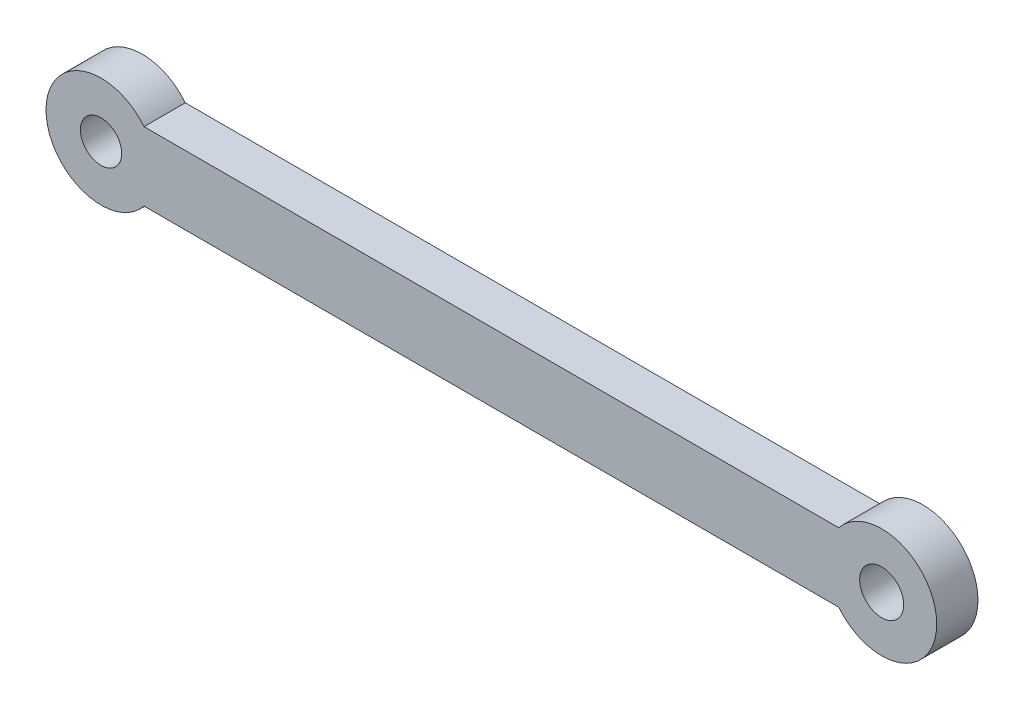
ISO-10303-21;
HEADER;
FILE_DESCRIPTION(('STEP AP214'),'2;1');
FILE_NAME('part.step','',(''),(''),'','','');
FILE_SCHEMA(('AUTOMOTIVE_DESIGN { 1 0 10303 214 1 1 1 1 }'));
ENDSEC;
DATA;
#1=APPLICATION_CONTEXT('core data for automotive mechanical design processes');
#2=APPLICATION_PROTOCOL_DEFINITION('international standard','automotive_design',2000,#1);
#3=PRODUCT_CONTEXT('',#1,'mechanical');
#4=PRODUCT('Part','Part','',(#3));
#5=PRODUCT_RELATED_PRODUCT_CATEGORY('part','',(#4));
#6=PRODUCT_DEFINITION_FORMATION('','',#4);
#7=PRODUCT_DEFINITION_CONTEXT('part definition',#1,'design');
#8=PRODUCT_DEFINITION('design','',#6,#7);
#9=PRODUCT_DEFINITION_SHAPE('','',#8);
#10=(LENGTH_UNIT() NAMED_UNIT(*) SI_UNIT(.MILLI.,.METRE.));
#11=(NAMED_UNIT(*) PLANE_ANGLE_UNIT() SI_UNIT($,.RADIAN.));
#12=(NAMED_UNIT(*) SI_UNIT($,.STERADIAN.) SOLID_ANGLE_UNIT());
#13=UNCERTAINTY_MEASURE_WITH_UNIT(LENGTH_MEASURE(1.E-05),#10,'distance_accuracy_value','');
#14=(GEOMETRIC_REPRESENTATION_CONTEXT(3) GLOBAL_UNCERTAINTY_ASSIGNED_CONTEXT((#13)) GLOBAL_UNIT_ASSIGNED_CONTEXT((#10,
#11,#12)) REPRESENTATION_CONTEXT('',''));
#15=CARTESIAN_POINT('',(0.,0.,0.));
#16=DIRECTION('',(0.,0.,1.));
#17=DIRECTION('',(1.,0.,0.));
#18=AXIS2_PLACEMENT_3D('',#15,#16,#17);
#19=CARTESIAN_POINT('',(-26.8775010008008,-2.5,3.));
#20=DIRECTION('',(0.,1.,0.));
#21=DIRECTION('',(-1.,0.,0.));
#22=AXIS2_PLACEMENT_3D('',#19,#20,#21);
#23=PLANE('',#22);
#24=DIRECTION('',(1.,0.,0.));
#25=VECTOR('',#24,1.);
#26=CARTESIAN_POINT('',(-26.8775010008008,-2.5,0.));
#27=LINE('',#26,#25);
#28=CARTESIAN_POINT('',(-26.8775010008008,-2.5,0.));
#29=VERTEX_POINT('',#28);
#30=CARTESIAN_POINT('',(23.6052121133673,-2.5,0.));
#31=VERTEX_POINT('',#30);
#32=EDGE_CURVE('E82',#29,#31,#27,.T.);
#33=ORIENTED_EDGE('',*,*,#32,.T.);
#34=DIRECTION('',(0.,0.,1.));
#35=VECTOR('',#34,1.);
#36=CARTESIAN_POINT('',(23.6052121133673,-2.5,0.));
#37=LINE('',#36,#35);
#38=CARTESIAN_POINT('',(23.6052121133673,-2.5,3.));
#39=VERTEX_POINT('',#38);
#40=EDGE_CURVE('E11',#31,#39,#37,.T.);
#41=ORIENTED_EDGE('',*,*,#40,.T.);
#42=DIRECTION('',(1.,0.,0.));
#43=VECTOR('',#42,1.);
#44=CARTESIAN_POINT('',(-26.8775010008008,-2.5,3.));
#45=LINE('',#44,#43);
#46=CARTESIAN_POINT('',(-26.8775010008008,-2.5,3.));
#47=VERTEX_POINT('',#46);
#48=EDGE_CURVE('E87',#47,#39,#45,.T.);
#49=ORIENTED_EDGE('',*,*,#48,.F.);
#50=DIRECTION('',(0.,0.,-1.));
#51=VECTOR('',#50,1.);
#52=CARTESIAN_POINT('',(-26.8775010008008,-2.5,3.));
#53=LINE('',#52,#51);
#54=EDGE_CURVE('E76',#47,#29,#53,.T.);
#55=ORIENTED_EDGE('',*,*,#54,.T.);
#56=EDGE_LOOP('',(#33,#41,#49,#55));
#57=FACE_BOUND('',#56,.T.);
#58=ADVANCED_FACE('F39',(#57),#23,.F.);
#59=CARTESIAN_POINT('',(-30.,0.,3.));
#60=DIRECTION('',(0.,0.,1.));
#61=DIRECTION('',(1.,0.,0.));
#62=AXIS2_PLACEMENT_3D('',#59,#60,#61);
#63=PLANE('',#62);
#64=CARTESIAN_POINT('',(26.7277111125666,0.,3.));
#65=DIRECTION('',(0.,0.,1.));
#66=DIRECTION('',(1.,0.,0.));
#67=AXIS2_PLACEMENT_3D('',#64,#65,#66);
#68=CIRCLE('',#67,4.);
#69=CARTESIAN_POINT('',(23.6052121133674,2.5,3.));
#70=VERTEX_POINT('',#69);
#71=EDGE_CURVE('E54',#39,#70,#68,.T.);
#72=ORIENTED_EDGE('',*,*,#71,.T.);
#73=DIRECTION('',(-1.,0.,0.));
#74=VECTOR('',#73,1.);
#75=CARTESIAN_POINT('',(-26.8775010008008,2.5,3.));
#76=LINE('',#75,#74);
#77=CARTESIAN_POINT('',(-26.8775010008008,2.5,3.));
#78=VERTEX_POINT('',#77);
#79=EDGE_CURVE('E95',#70,#78,#76,.T.);
#80=ORIENTED_EDGE('',*,*,#79,.T.);
#81=CARTESIAN_POINT('',(-30.,0.,3.));
#82=DIRECTION('',(0.,0.,1.));
#83=DIRECTION('',(1.,0.,0.));
#84=AXIS2_PLACEMENT_3D('',#81,#82,#83);
#85=CIRCLE('',#84,4.);
#86=EDGE_CURVE('E60',#78,#47,#85,.T.);
#87=ORIENTED_EDGE('',*,*,#86,.T.);
#88=ORIENTED_EDGE('',*,*,#48,.T.);
#89=EDGE_LOOP('',(#72,#80,#87,#88));
#90=FACE_BOUND('',#89,.T.);
#91=CARTESIAN_POINT('',(26.7277111125666,0.,3.));
#92=DIRECTION('',(0.,0.,1.));
#93=DIRECTION('',(1.,0.,0.));
#94=AXIS2_PLACEMENT_3D('',#91,#92,#93);
#95=CIRCLE('',#94,1.6);
#96=CARTESIAN_POINT('',(28.3277111125666,0.,3.));
#97=VERTEX_POINT('',#96);
#98=EDGE_CURVE('E109',#97,#97,#95,.T.);
#99=ORIENTED_EDGE('',*,*,#98,.F.);
#100=EDGE_LOOP('',(#99));
#101=FACE_BOUND('',#100,.T.);
#102=CARTESIAN_POINT('',(-30.,0.,3.));
#103=DIRECTION('',(0.,0.,1.));
#104=DIRECTION('',(1.,0.,0.));
#105=AXIS2_PLACEMENT_3D('',#102,#103,#104);
#106=CIRCLE('',#105,1.5);
#107=CARTESIAN_POINT('',(-28.5,0.,3.));
#108=VERTEX_POINT('',#107);
#109=EDGE_CURVE('E100',#108,#108,#106,.T.);
#110=ORIENTED_EDGE('',*,*,#109,.F.);
#111=EDGE_LOOP('',(#110));
#112=FACE_BOUND('',#111,.T.);
#113=ADVANCED_FACE('F125',(#90,#101,#112),#63,.T.);
#114=CARTESIAN_POINT('',(-30.,0.,0.));
#115=DIRECTION('',(0.,0.,1.));
#116=DIRECTION('',(1.,0.,0.));
#117=AXIS2_PLACEMENT_3D('',#114,#115,#116);
#118=PLANE('',#117);
#119=DIRECTION('',(-1.,0.,0.));
#120=VECTOR('',#119,1.);
#121=CARTESIAN_POINT('',(-26.8775010008008,2.5,0.));
#122=LINE('',#121,#120);
#123=CARTESIAN_POINT('',(23.6052121133674,2.5,0.));
#124=VERTEX_POINT('',#123);
#125=CARTESIAN_POINT('',(-26.8775010008008,2.5,0.));
#126=VERTEX_POINT('',#125);
#127=EDGE_CURVE('E83',#124,#126,#122,.T.);
#128=ORIENTED_EDGE('',*,*,#127,.F.);
#129=CARTESIAN_POINT('',(26.7277111125666,0.,0.));
#130=DIRECTION('',(0.,0.,1.));
#131=DIRECTION('',(1.,0.,0.));
#132=AXIS2_PLACEMENT_3D('',#129,#130,#131);
#133=CIRCLE('',#132,4.);
#134=EDGE_CURVE('E93',#31,#124,#133,.T.);
#135=ORIENTED_EDGE('',*,*,#134,.F.);
#136=ORIENTED_EDGE('',*,*,#32,.F.);
#137=CARTESIAN_POINT('',(-30.,0.,0.));
#138=DIRECTION('',(0.,0.,1.));
#139=DIRECTION('',(1.,0.,0.));
#140=AXIS2_PLACEMENT_3D('',#137,#138,#139);
#141=CIRCLE('',#140,4.);
#142=EDGE_CURVE('E73',#126,#29,#141,.T.);
#143=ORIENTED_EDGE('',*,*,#142,.F.);
#144=EDGE_LOOP('',(#128,#135,#136,#143));
#145=FACE_BOUND('',#144,.T.);
#146=CARTESIAN_POINT('',(26.7277111125666,0.,0.));
#147=DIRECTION('',(0.,0.,1.));
#148=DIRECTION('',(1.,0.,0.));
#149=AXIS2_PLACEMENT_3D('',#146,#147,#148);
#150=CIRCLE('',#149,1.6);
#151=CARTESIAN_POINT('',(28.3277111125666,0.,0.));
#152=VERTEX_POINT('',#151);
#153=EDGE_CURVE('E106',#152,#152,#150,.T.);
#154=ORIENTED_EDGE('',*,*,#153,.T.);
#155=EDGE_LOOP('',(#154));
#156=FACE_BOUND('',#155,.T.);
#157=CARTESIAN_POINT('',(-30.,0.,0.));
#158=DIRECTION('',(0.,0.,1.));
#159=DIRECTION('',(1.,0.,0.));
#160=AXIS2_PLACEMENT_3D('',#157,#158,#159);
#161=CIRCLE('',#160,1.5);
#162=CARTESIAN_POINT('',(-28.5,0.,0.));
#163=VERTEX_POINT('',#162);
#164=EDGE_CURVE('E103',#163,#163,#161,.T.);
#165=ORIENTED_EDGE('',*,*,#164,.T.);
#166=EDGE_LOOP('',(#165));
#167=FACE_BOUND('',#166,.T.);
#168=ADVANCED_FACE('F90',(#145,#156,#167),#118,.F.);
#169=CARTESIAN_POINT('',(-26.8775010008008,2.5,3.));
#170=DIRECTION('',(0.,-1.,0.));
#171=DIRECTION('',(1.,0.,0.));
#172=AXIS2_PLACEMENT_3D('',#169,#170,#171);
#173=PLANE('',#172);
#174=ORIENTED_EDGE('',*,*,#79,.F.);
#175=DIRECTION('',(0.,0.,1.));
#176=VECTOR('',#175,1.);
#177=CARTESIAN_POINT('',(23.6052121133674,2.5,0.));
#178=LINE('',#177,#176);
#179=EDGE_CURVE('E112',#70,#124,#178,.F.);
#180=ORIENTED_EDGE('',*,*,#179,.T.);
#181=ORIENTED_EDGE('',*,*,#127,.T.);
#182=DIRECTION('',(0.,0.,-1.));
#183=VECTOR('',#182,1.);
#184=CARTESIAN_POINT('',(-26.8775010008008,2.5,3.));
#185=LINE('',#184,#183);
#186=EDGE_CURVE('E47',#78,#126,#185,.T.);
#187=ORIENTED_EDGE('',*,*,#186,.F.);
#188=EDGE_LOOP('',(#174,#180,#181,#187));
#189=FACE_BOUND('',#188,.T.);
#190=ADVANCED_FACE('F41',(#189),#173,.F.);
#191=CARTESIAN_POINT('',(-30.,0.,3.));
#192=DIRECTION('',(0.,0.,-1.));
#193=DIRECTION('',(-1.,0.,0.));
#194=AXIS2_PLACEMENT_3D('',#191,#192,#193);
#195=CYLINDRICAL_SURFACE('',#194,4.);
#196=ORIENTED_EDGE('',*,*,#142,.T.);
#197=ORIENTED_EDGE('',*,*,#54,.F.);
#198=ORIENTED_EDGE('',*,*,#86,.F.);
#199=ORIENTED_EDGE('',*,*,#186,.T.);
#200=EDGE_LOOP('',(#196,#197,#198,#199));
#201=FACE_BOUND('',#200,.T.);
#202=ADVANCED_FACE('F75',(#201),#195,.T.);
#203=CARTESIAN_POINT('',(-30.,0.,3.));
#204=DIRECTION('',(0.,0.,-1.));
#205=DIRECTION('',(-1.,0.,0.));
#206=AXIS2_PLACEMENT_3D('',#203,#204,#205);
#207=CYLINDRICAL_SURFACE('',#206,1.5);
#208=ORIENTED_EDGE('',*,*,#109,.T.);
#209=EDGE_LOOP('',(#208));
#210=FACE_BOUND('',#209,.T.);
#211=ORIENTED_EDGE('',*,*,#164,.F.);
#212=EDGE_LOOP('',(#211));
#213=FACE_BOUND('',#212,.T.);
#214=ADVANCED_FACE('F133',(#210,#213),#207,.F.);
#215=CARTESIAN_POINT('',(26.7277111125666,0.,0.));
#216=DIRECTION('',(0.,0.,1.));
#217=DIRECTION('',(1.,0.,0.));
#218=AXIS2_PLACEMENT_3D('',#215,#216,#217);
#219=CYLINDRICAL_SURFACE('',#218,1.6);
#220=ORIENTED_EDGE('',*,*,#153,.F.);
#221=EDGE_LOOP('',(#220));
#222=FACE_BOUND('',#221,.T.);
#223=ORIENTED_EDGE('',*,*,#98,.T.);
#224=EDGE_LOOP('',(#223));
#225=FACE_BOUND('',#224,.T.);
#226=ADVANCED_FACE('F136',(#222,#225),#219,.F.);
#227=CARTESIAN_POINT('',(26.7277111125666,0.,0.));
#228=DIRECTION('',(0.,0.,1.));
#229=DIRECTION('',(1.,0.,0.));
#230=AXIS2_PLACEMENT_3D('',#227,#228,#229);
#231=CYLINDRICAL_SURFACE('',#230,4.);
#232=ORIENTED_EDGE('',*,*,#71,.F.);
#233=ORIENTED_EDGE('',*,*,#40,.F.);
#234=ORIENTED_EDGE('',*,*,#134,.T.);
#235=ORIENTED_EDGE('',*,*,#179,.F.);
#236=EDGE_LOOP('',(#232,#233,#234,#235));
#237=FACE_BOUND('',#236,.T.);
#238=ADVANCED_FACE('F120',(#237),#231,.T.);
#239=CLOSED_SHELL('',(#58,#113,#168,#190,#202,#214,#226,#238));
#240=MANIFOLD_SOLID_BREP('B2',#239);
#241=ADVANCED_BREP_SHAPE_REPRESENTATION('',(#18,#240),#14);
#242=SHAPE_DEFINITION_REPRESENTATION(#9,#241);
ENDSEC;
END-ISO-10303-21;
